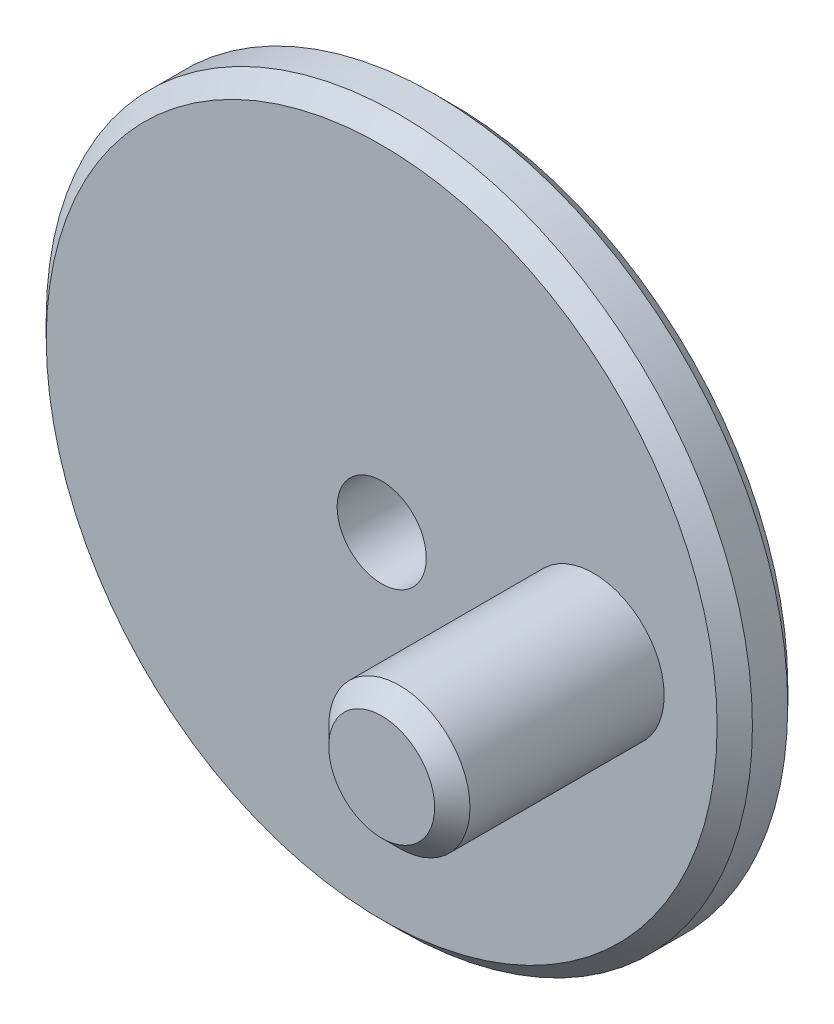
ISO-10303-21;
HEADER;
FILE_DESCRIPTION(('STEP AP214'),'2;1');
FILE_NAME('part.step','',(''),(''),'','','');
FILE_SCHEMA(('AUTOMOTIVE_DESIGN { 1 0 10303 214 1 1 1 1 }'));
ENDSEC;
DATA;
#1=APPLICATION_CONTEXT('core data for automotive mechanical design processes');
#2=APPLICATION_PROTOCOL_DEFINITION('international standard','automotive_design',2000,#1);
#3=PRODUCT_CONTEXT('',#1,'mechanical');
#4=PRODUCT('Part','Part','',(#3));
#5=PRODUCT_RELATED_PRODUCT_CATEGORY('part','',(#4));
#6=PRODUCT_DEFINITION_FORMATION('','',#4);
#7=PRODUCT_DEFINITION_CONTEXT('part definition',#1,'design');
#8=PRODUCT_DEFINITION('design','',#6,#7);
#9=PRODUCT_DEFINITION_SHAPE('','',#8);
#10=(LENGTH_UNIT() NAMED_UNIT(*) SI_UNIT(.MILLI.,.METRE.));
#11=(NAMED_UNIT(*) PLANE_ANGLE_UNIT() SI_UNIT($,.RADIAN.));
#12=(NAMED_UNIT(*) SI_UNIT($,.STERADIAN.) SOLID_ANGLE_UNIT());
#13=UNCERTAINTY_MEASURE_WITH_UNIT(LENGTH_MEASURE(1.E-05),#10,'distance_accuracy_value','');
#14=(GEOMETRIC_REPRESENTATION_CONTEXT(3) GLOBAL_UNCERTAINTY_ASSIGNED_CONTEXT((#13)) GLOBAL_UNIT_ASSIGNED_CONTEXT((#10,
#11,#12)) REPRESENTATION_CONTEXT('',''));
#15=CARTESIAN_POINT('',(0.,0.,0.));
#16=DIRECTION('',(0.,0.,1.));
#17=DIRECTION('',(1.,0.,0.));
#18=AXIS2_PLACEMENT_3D('',#15,#16,#17);
#19=CARTESIAN_POINT('',(0.,0.,2.));
#20=DIRECTION('',(0.,0.,-1.));
#21=DIRECTION('',(-1.,0.,0.));
#22=AXIS2_PLACEMENT_3D('',#19,#20,#21);
#23=CYLINDRICAL_SURFACE('',#22,20.);
#24=CARTESIAN_POINT('',(0.,0.,-0.999999999999996));
#25=DIRECTION('',(0.,0.,1.));
#26=DIRECTION('',(1.,0.,0.));
#27=AXIS2_PLACEMENT_3D('',#24,#25,#26);
#28=CIRCLE('',#27,20.);
#29=CARTESIAN_POINT('',(20.,0.,-0.999999999999996));
#30=VERTEX_POINT('',#29);
#31=EDGE_CURVE('E58',#30,#30,#28,.T.);
#32=ORIENTED_EDGE('',*,*,#31,.T.);
#33=EDGE_LOOP('',(#32));
#34=FACE_BOUND('',#33,.T.);
#35=CARTESIAN_POINT('',(0.,0.,0.999999999999996));
#36=DIRECTION('',(0.,0.,1.));
#37=DIRECTION('',(1.,0.,0.));
#38=AXIS2_PLACEMENT_3D('',#35,#36,#37);
#39=CIRCLE('',#38,20.);
#40=CARTESIAN_POINT('',(20.,0.,0.999999999999996));
#41=VERTEX_POINT('',#40);
#42=EDGE_CURVE('E64',#41,#41,#39,.F.);
#43=ORIENTED_EDGE('',*,*,#42,.T.);
#44=EDGE_LOOP('',(#43));
#45=FACE_BOUND('',#44,.T.);
#46=ADVANCED_FACE('F39',(#34,#45),#23,.T.);
#47=CARTESIAN_POINT('',(0.,0.,2.));
#48=DIRECTION('',(0.,0.,1.));
#49=DIRECTION('',(1.,0.,0.));
#50=AXIS2_PLACEMENT_3D('',#47,#48,#49);
#51=PLANE('',#50);
#52=CARTESIAN_POINT('',(0.,0.,2.));
#53=DIRECTION('',(0.,0.,1.));
#54=DIRECTION('',(1.,0.,0.));
#55=AXIS2_PLACEMENT_3D('',#52,#53,#54);
#56=CIRCLE('',#55,19.);
#57=CARTESIAN_POINT('',(19.,0.,2.));
#58=VERTEX_POINT('',#57);
#59=EDGE_CURVE('E51',#58,#58,#56,.T.);
#60=ORIENTED_EDGE('',*,*,#59,.T.);
#61=EDGE_LOOP('',(#60));
#62=FACE_BOUND('',#61,.T.);
#63=CARTESIAN_POINT('',(0.,0.,2.));
#64=DIRECTION('',(0.,0.,1.));
#65=DIRECTION('',(1.,0.,0.));
#66=AXIS2_PLACEMENT_3D('',#63,#64,#65);
#67=CIRCLE('',#66,2.525);
#68=CARTESIAN_POINT('',(2.525,0.,2.));
#69=VERTEX_POINT('',#68);
#70=EDGE_CURVE('E69',#69,#69,#67,.F.);
#71=ORIENTED_EDGE('',*,*,#70,.T.);
#72=EDGE_LOOP('',(#71));
#73=FACE_BOUND('',#72,.T.);
#74=CARTESIAN_POINT('',(12.,0.,2.));
#75=DIRECTION('',(0.,0.,1.));
#76=DIRECTION('',(1.,0.,0.));
#77=AXIS2_PLACEMENT_3D('',#74,#75,#76);
#78=CIRCLE('',#77,4.);
#79=CARTESIAN_POINT('',(16.,0.,2.));
#80=VERTEX_POINT('',#79);
#81=EDGE_CURVE('E66',#80,#80,#78,.T.);
#82=ORIENTED_EDGE('',*,*,#81,.F.);
#83=EDGE_LOOP('',(#82));
#84=FACE_BOUND('',#83,.T.);
#85=ADVANCED_FACE('F82',(#62,#73,#84),#51,.T.);
#86=CARTESIAN_POINT('',(0.,0.,-2.));
#87=DIRECTION('',(0.,0.,1.));
#88=DIRECTION('',(1.,0.,0.));
#89=AXIS2_PLACEMENT_3D('',#86,#87,#88);
#90=PLANE('',#89);
#91=CARTESIAN_POINT('',(0.,0.,-2.));
#92=DIRECTION('',(0.,0.,1.));
#93=DIRECTION('',(1.,0.,0.));
#94=AXIS2_PLACEMENT_3D('',#91,#92,#93);
#95=CIRCLE('',#94,19.);
#96=CARTESIAN_POINT('',(19.,0.,-2.));
#97=VERTEX_POINT('',#96);
#98=EDGE_CURVE('E54',#97,#97,#95,.F.);
#99=ORIENTED_EDGE('',*,*,#98,.T.);
#100=EDGE_LOOP('',(#99));
#101=FACE_BOUND('',#100,.T.);
#102=CARTESIAN_POINT('',(0.,0.,-2.));
#103=DIRECTION('',(0.,0.,-1.));
#104=DIRECTION('',(-1.,0.,0.));
#105=AXIS2_PLACEMENT_3D('',#102,#103,#104);
#106=CIRCLE('',#105,2.525);
#107=CARTESIAN_POINT('',(-2.525,0.,-2.));
#108=VERTEX_POINT('',#107);
#109=EDGE_CURVE('E68',#108,#108,#106,.T.);
#110=ORIENTED_EDGE('',*,*,#109,.F.);
#111=EDGE_LOOP('',(#110));
#112=FACE_BOUND('',#111,.T.);
#113=ADVANCED_FACE('F76',(#101,#112),#90,.F.);
#114=CARTESIAN_POINT('',(12.,0.,14.));
#115=DIRECTION('',(0.,0.,-1.));
#116=DIRECTION('',(-1.,0.,0.));
#117=AXIS2_PLACEMENT_3D('',#114,#115,#116);
#118=CYLINDRICAL_SURFACE('',#117,4.);
#119=CARTESIAN_POINT('',(12.,0.,13.));
#120=DIRECTION('',(0.,0.,1.));
#121=DIRECTION('',(1.,0.,0.));
#122=AXIS2_PLACEMENT_3D('',#119,#120,#121);
#123=CIRCLE('',#122,4.);
#124=CARTESIAN_POINT('',(16.,0.,13.));
#125=VERTEX_POINT('',#124);
#126=EDGE_CURVE('E10',#125,#125,#123,.F.);
#127=ORIENTED_EDGE('',*,*,#126,.T.);
#128=EDGE_LOOP('',(#127));
#129=FACE_BOUND('',#128,.T.);
#130=ORIENTED_EDGE('',*,*,#81,.T.);
#131=EDGE_LOOP('',(#130));
#132=FACE_BOUND('',#131,.T.);
#133=ADVANCED_FACE('F78',(#129,#132),#118,.T.);
#134=CARTESIAN_POINT('',(12.,0.,14.));
#135=DIRECTION('',(0.,0.,1.));
#136=DIRECTION('',(1.,0.,0.));
#137=AXIS2_PLACEMENT_3D('',#134,#135,#136);
#138=PLANE('',#137);
#139=CARTESIAN_POINT('',(12.,0.,14.));
#140=DIRECTION('',(0.,0.,1.));
#141=DIRECTION('',(1.,0.,0.));
#142=AXIS2_PLACEMENT_3D('',#139,#140,#141);
#143=CIRCLE('',#142,3.00000000000001);
#144=CARTESIAN_POINT('',(15.,0.,14.));
#145=VERTEX_POINT('',#144);
#146=EDGE_CURVE('E50',#145,#145,#143,.T.);
#147=ORIENTED_EDGE('',*,*,#146,.T.);
#148=EDGE_LOOP('',(#147));
#149=FACE_BOUND('',#148,.T.);
#150=ADVANCED_FACE('F87',(#149),#138,.T.);
#151=CARTESIAN_POINT('',(0.,0.,14.001));
#152=DIRECTION('',(0.,0.,-1.));
#153=DIRECTION('',(-1.,0.,0.));
#154=AXIS2_PLACEMENT_3D('',#151,#152,#153);
#155=CYLINDRICAL_SURFACE('',#154,2.525);
#156=ORIENTED_EDGE('',*,*,#70,.F.);
#157=EDGE_LOOP('',(#156));
#158=FACE_BOUND('',#157,.T.);
#159=ORIENTED_EDGE('',*,*,#109,.T.);
#160=EDGE_LOOP('',(#159));
#161=FACE_BOUND('',#160,.T.);
#162=ADVANCED_FACE('F77',(#158,#161),#155,.F.);
#163=CARTESIAN_POINT('',(0.,0.,-0.999999999999996));
#164=DIRECTION('',(0.,0.,1.));
#165=DIRECTION('',(1.,0.,0.));
#166=AXIS2_PLACEMENT_3D('',#163,#164,#165);
#167=CONICAL_SURFACE('',#166,20.,0.78539816339745);
#168=ORIENTED_EDGE('',*,*,#98,.F.);
#169=EDGE_LOOP('',(#168));
#170=FACE_BOUND('',#169,.T.);
#171=ORIENTED_EDGE('',*,*,#31,.F.);
#172=EDGE_LOOP('',(#171));
#173=FACE_BOUND('',#172,.T.);
#174=ADVANCED_FACE('F103',(#170,#173),#167,.T.);
#175=CARTESIAN_POINT('',(0.,0.,2.));
#176=DIRECTION('',(0.,0.,-1.));
#177=DIRECTION('',(-1.,0.,0.));
#178=AXIS2_PLACEMENT_3D('',#175,#176,#177);
#179=CONICAL_SURFACE('',#178,19.,0.785398163397441);
#180=ORIENTED_EDGE('',*,*,#42,.F.);
#181=EDGE_LOOP('',(#180));
#182=FACE_BOUND('',#181,.T.);
#183=ORIENTED_EDGE('',*,*,#59,.F.);
#184=EDGE_LOOP('',(#183));
#185=FACE_BOUND('',#184,.T.);
#186=ADVANCED_FACE('F106',(#182,#185),#179,.T.);
#187=CARTESIAN_POINT('',(12.,0.,14.));
#188=DIRECTION('',(0.,0.,-1.));
#189=DIRECTION('',(-1.,0.,0.));
#190=AXIS2_PLACEMENT_3D('',#187,#188,#189);
#191=CONICAL_SURFACE('',#190,3.00000000000001,0.785398163397445);
#192=ORIENTED_EDGE('',*,*,#126,.F.);
#193=EDGE_LOOP('',(#192));
#194=FACE_BOUND('',#193,.T.);
#195=ORIENTED_EDGE('',*,*,#146,.F.);
#196=EDGE_LOOP('',(#195));
#197=FACE_BOUND('',#196,.T.);
#198=ADVANCED_FACE('F45',(#194,#197),#191,.T.);
#199=CLOSED_SHELL('',(#46,#85,#113,#133,#150,#162,#174,#186,#198));
#200=MANIFOLD_SOLID_BREP('B2',#199);
#201=ADVANCED_BREP_SHAPE_REPRESENTATION('',(#18,#200),#14);
#202=SHAPE_DEFINITION_REPRESENTATION(#9,#201);
ENDSEC;
END-ISO-10303-21;
